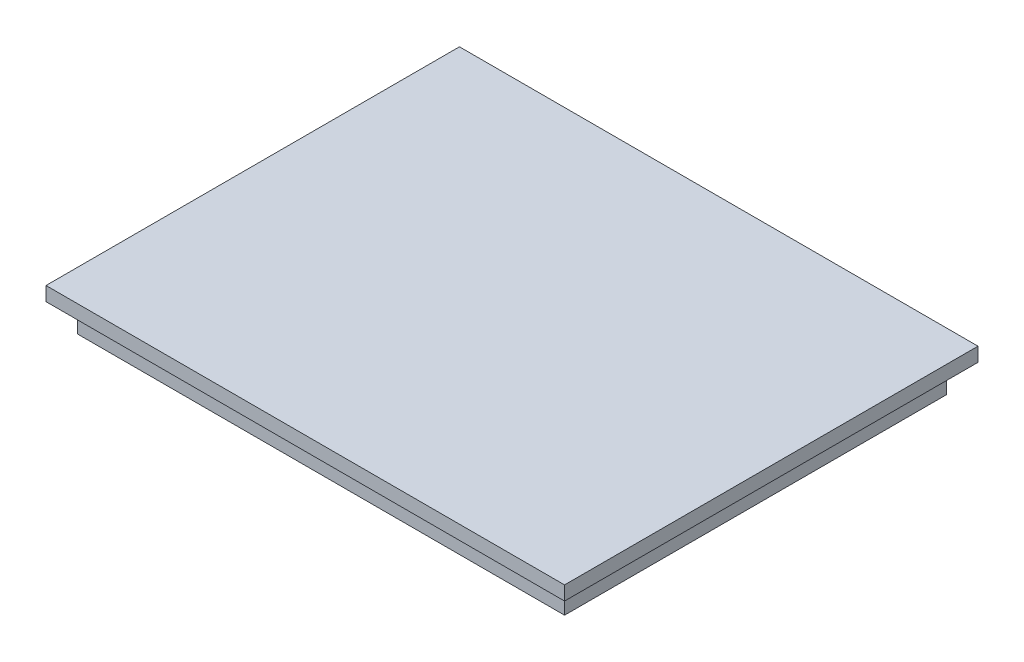
ISO-10303-21;
HEADER;
FILE_DESCRIPTION(('STEP AP214'),'2;1');
FILE_NAME('part.step','',(''),(''),'','','');
FILE_SCHEMA(('AUTOMOTIVE_DESIGN { 1 0 10303 214 1 1 1 1 }'));
ENDSEC;
DATA;
#1=APPLICATION_CONTEXT('core data for automotive mechanical design processes');
#2=APPLICATION_PROTOCOL_DEFINITION('international standard','automotive_design',2000,#1);
#3=PRODUCT_CONTEXT('',#1,'mechanical');
#4=PRODUCT('Part','Part','',(#3));
#5=PRODUCT_RELATED_PRODUCT_CATEGORY('part','',(#4));
#6=PRODUCT_DEFINITION_FORMATION('','',#4);
#7=PRODUCT_DEFINITION_CONTEXT('part definition',#1,'design');
#8=PRODUCT_DEFINITION('design','',#6,#7);
#9=PRODUCT_DEFINITION_SHAPE('','',#8);
#10=(LENGTH_UNIT() NAMED_UNIT(*) SI_UNIT(.MILLI.,.METRE.));
#11=(NAMED_UNIT(*) PLANE_ANGLE_UNIT() SI_UNIT($,.RADIAN.));
#12=(NAMED_UNIT(*) SI_UNIT($,.STERADIAN.) SOLID_ANGLE_UNIT());
#13=UNCERTAINTY_MEASURE_WITH_UNIT(LENGTH_MEASURE(1.E-05),#10,'distance_accuracy_value','');
#14=(GEOMETRIC_REPRESENTATION_CONTEXT(3) GLOBAL_UNCERTAINTY_ASSIGNED_CONTEXT((#13)) GLOBAL_UNIT_ASSIGNED_CONTEXT((#10,
#11,#12)) REPRESENTATION_CONTEXT('',''));
#15=CARTESIAN_POINT('',(0.,0.,0.));
#16=DIRECTION('',(0.,0.,1.));
#17=DIRECTION('',(1.,0.,0.));
#18=AXIS2_PLACEMENT_3D('',#15,#16,#17);
#19=CARTESIAN_POINT('',(0.,0.,0.));
#20=DIRECTION('',(0.,-1.,0.));
#21=DIRECTION('',(0.,0.,-1.));
#22=AXIS2_PLACEMENT_3D('',#19,#20,#21);
#23=PLANE('',#22);
#24=DIRECTION('',(0.,0.,-1.));
#25=VECTOR('',#24,1.);
#26=CARTESIAN_POINT('',(37.,0.,29.5));
#27=LINE('',#26,#25);
#28=CARTESIAN_POINT('',(37.,0.,29.5));
#29=VERTEX_POINT('',#28);
#30=CARTESIAN_POINT('',(37.,0.,-29.5));
#31=VERTEX_POINT('',#30);
#32=EDGE_CURVE('E217',#29,#31,#27,.T.);
#33=ORIENTED_EDGE('',*,*,#32,.F.);
#34=DIRECTION('',(1.,0.,0.));
#35=VECTOR('',#34,1.);
#36=CARTESIAN_POINT('',(-37.,0.,29.5));
#37=LINE('',#36,#35);
#38=CARTESIAN_POINT('',(-37.,0.,29.5));
#39=VERTEX_POINT('',#38);
#40=EDGE_CURVE('E229',#39,#29,#37,.T.);
#41=ORIENTED_EDGE('',*,*,#40,.F.);
#42=DIRECTION('',(0.,0.,1.));
#43=VECTOR('',#42,1.);
#44=CARTESIAN_POINT('',(-37.,0.,29.5));
#45=LINE('',#44,#43);
#46=CARTESIAN_POINT('',(-37.,0.,-29.5));
#47=VERTEX_POINT('',#46);
#48=EDGE_CURVE('E245',#47,#39,#45,.T.);
#49=ORIENTED_EDGE('',*,*,#48,.F.);
#50=DIRECTION('',(-1.,0.,0.));
#51=VECTOR('',#50,1.);
#52=CARTESIAN_POINT('',(-37.,0.,-29.5));
#53=LINE('',#52,#51);
#54=EDGE_CURVE('E242',#31,#47,#53,.T.);
#55=ORIENTED_EDGE('',*,*,#54,.F.);
#56=EDGE_LOOP('',(#33,#41,#49,#55));
#57=FACE_BOUND('',#56,.T.);
#58=DIRECTION('',(0.,0.,1.));
#59=VECTOR('',#58,1.);
#60=CARTESIAN_POINT('',(34.75,0.,0.));
#61=LINE('',#60,#59);
#62=CARTESIAN_POINT('',(34.75,0.,-27.25));
#63=VERTEX_POINT('',#62);
#64=CARTESIAN_POINT('',(34.75,0.,27.25));
#65=VERTEX_POINT('',#64);
#66=EDGE_CURVE('E63',#63,#65,#61,.T.);
#67=ORIENTED_EDGE('',*,*,#66,.F.);
#68=DIRECTION('',(1.,0.,0.));
#69=VECTOR('',#68,1.);
#70=CARTESIAN_POINT('',(0.,0.,-27.25));
#71=LINE('',#70,#69);
#72=CARTESIAN_POINT('',(-34.75,0.,-27.25));
#73=VERTEX_POINT('',#72);
#74=EDGE_CURVE('E192',#73,#63,#71,.T.);
#75=ORIENTED_EDGE('',*,*,#74,.F.);
#76=DIRECTION('',(0.,0.,1.));
#77=VECTOR('',#76,1.);
#78=CARTESIAN_POINT('',(-34.75,0.,0.));
#79=LINE('',#78,#77);
#80=CARTESIAN_POINT('',(-34.75,0.,27.25));
#81=VERTEX_POINT('',#80);
#82=EDGE_CURVE('E153',#73,#81,#79,.T.);
#83=ORIENTED_EDGE('',*,*,#82,.T.);
#84=DIRECTION('',(1.,0.,0.));
#85=VECTOR('',#84,1.);
#86=CARTESIAN_POINT('',(0.,0.,27.25));
#87=LINE('',#86,#85);
#88=EDGE_CURVE('E198',#81,#65,#87,.T.);
#89=ORIENTED_EDGE('',*,*,#88,.T.);
#90=EDGE_LOOP('',(#67,#75,#83,#89));
#91=FACE_BOUND('',#90,.T.);
#92=ADVANCED_FACE('F39',(#57,#91),#23,.T.);
#93=CARTESIAN_POINT('',(37.,2.,29.5));
#94=DIRECTION('',(-1.,0.,0.));
#95=DIRECTION('',(0.,0.,1.));
#96=AXIS2_PLACEMENT_3D('',#93,#94,#95);
#97=PLANE('',#96);
#98=ORIENTED_EDGE('',*,*,#32,.T.);
#99=DIRECTION('',(0.,-1.,0.));
#100=VECTOR('',#99,1.);
#101=CARTESIAN_POINT('',(37.,2.,-29.5));
#102=LINE('',#101,#100);
#103=CARTESIAN_POINT('',(37.,2.,-29.5));
#104=VERTEX_POINT('',#103);
#105=EDGE_CURVE('E11',#104,#31,#102,.T.);
#106=ORIENTED_EDGE('',*,*,#105,.F.);
#107=DIRECTION('',(0.,0.,-1.));
#108=VECTOR('',#107,1.);
#109=CARTESIAN_POINT('',(37.,2.,29.5));
#110=LINE('',#109,#108);
#111=CARTESIAN_POINT('',(37.,2.,29.5));
#112=VERTEX_POINT('',#111);
#113=EDGE_CURVE('E224',#112,#104,#110,.T.);
#114=ORIENTED_EDGE('',*,*,#113,.F.);
#115=DIRECTION('',(0.,-1.,0.));
#116=VECTOR('',#115,1.);
#117=CARTESIAN_POINT('',(37.,2.,29.5));
#118=LINE('',#117,#116);
#119=EDGE_CURVE('E238',#112,#29,#118,.T.);
#120=ORIENTED_EDGE('',*,*,#119,.T.);
#121=EDGE_LOOP('',(#98,#106,#114,#120));
#122=FACE_BOUND('',#121,.T.);
#123=ADVANCED_FACE('F41',(#122),#97,.F.);
#124=CARTESIAN_POINT('',(-37.,2.,-29.5));
#125=DIRECTION('',(0.,0.,1.));
#126=DIRECTION('',(1.,0.,0.));
#127=AXIS2_PLACEMENT_3D('',#124,#125,#126);
#128=PLANE('',#127);
#129=ORIENTED_EDGE('',*,*,#54,.T.);
#130=DIRECTION('',(0.,-1.,0.));
#131=VECTOR('',#130,1.);
#132=CARTESIAN_POINT('',(-37.,2.,-29.5));
#133=LINE('',#132,#131);
#134=CARTESIAN_POINT('',(-37.,2.,-29.5));
#135=VERTEX_POINT('',#134);
#136=EDGE_CURVE('E48',#135,#47,#133,.T.);
#137=ORIENTED_EDGE('',*,*,#136,.F.);
#138=DIRECTION('',(-1.,0.,0.));
#139=VECTOR('',#138,1.);
#140=CARTESIAN_POINT('',(-37.,2.,-29.5));
#141=LINE('',#140,#139);
#142=EDGE_CURVE('E228',#104,#135,#141,.T.);
#143=ORIENTED_EDGE('',*,*,#142,.F.);
#144=ORIENTED_EDGE('',*,*,#105,.T.);
#145=EDGE_LOOP('',(#129,#137,#143,#144));
#146=FACE_BOUND('',#145,.T.);
#147=ADVANCED_FACE('F277',(#146),#128,.F.);
#148=CARTESIAN_POINT('',(-37.,2.,29.5));
#149=DIRECTION('',(1.,0.,0.));
#150=DIRECTION('',(0.,0.,-1.));
#151=AXIS2_PLACEMENT_3D('',#148,#149,#150);
#152=PLANE('',#151);
#153=ORIENTED_EDGE('',*,*,#48,.T.);
#154=DIRECTION('',(0.,-1.,0.));
#155=VECTOR('',#154,1.);
#156=CARTESIAN_POINT('',(-37.,2.,29.5));
#157=LINE('',#156,#155);
#158=CARTESIAN_POINT('',(-37.,2.,29.5));
#159=VERTEX_POINT('',#158);
#160=EDGE_CURVE('E253',#159,#39,#157,.T.);
#161=ORIENTED_EDGE('',*,*,#160,.F.);
#162=DIRECTION('',(0.,0.,1.));
#163=VECTOR('',#162,1.);
#164=CARTESIAN_POINT('',(-37.,2.,29.5));
#165=LINE('',#164,#163);
#166=EDGE_CURVE('E232',#135,#159,#165,.T.);
#167=ORIENTED_EDGE('',*,*,#166,.F.);
#168=ORIENTED_EDGE('',*,*,#136,.T.);
#169=EDGE_LOOP('',(#153,#161,#167,#168));
#170=FACE_BOUND('',#169,.T.);
#171=ADVANCED_FACE('F262',(#170),#152,.F.);
#172=CARTESIAN_POINT('',(-37.,2.,29.5));
#173=DIRECTION('',(0.,0.,-1.));
#174=DIRECTION('',(-1.,0.,0.));
#175=AXIS2_PLACEMENT_3D('',#172,#173,#174);
#176=PLANE('',#175);
#177=ORIENTED_EDGE('',*,*,#40,.T.);
#178=ORIENTED_EDGE('',*,*,#119,.F.);
#179=DIRECTION('',(1.,0.,0.));
#180=VECTOR('',#179,1.);
#181=CARTESIAN_POINT('',(-37.,2.,29.5));
#182=LINE('',#181,#180);
#183=EDGE_CURVE('E235',#159,#112,#182,.T.);
#184=ORIENTED_EDGE('',*,*,#183,.F.);
#185=ORIENTED_EDGE('',*,*,#160,.T.);
#186=EDGE_LOOP('',(#177,#178,#184,#185));
#187=FACE_BOUND('',#186,.T.);
#188=ADVANCED_FACE('F270',(#187),#176,.F.);
#189=CARTESIAN_POINT('',(0.,2.,0.));
#190=DIRECTION('',(0.,-1.,0.));
#191=DIRECTION('',(0.,0.,-1.));
#192=AXIS2_PLACEMENT_3D('',#189,#190,#191);
#193=PLANE('',#192);
#194=ORIENTED_EDGE('',*,*,#113,.T.);
#195=ORIENTED_EDGE('',*,*,#142,.T.);
#196=ORIENTED_EDGE('',*,*,#166,.T.);
#197=ORIENTED_EDGE('',*,*,#183,.T.);
#198=EDGE_LOOP('',(#194,#195,#196,#197));
#199=FACE_BOUND('',#198,.T.);
#200=ADVANCED_FACE('F276',(#199),#193,.F.);
#201=CARTESIAN_POINT('',(0.,-4.,-27.25));
#202=DIRECTION('',(0.,0.,1.));
#203=DIRECTION('',(1.,0.,0.));
#204=AXIS2_PLACEMENT_3D('',#201,#202,#203);
#205=PLANE('',#204);
#206=ORIENTED_EDGE('',*,*,#74,.T.);
#207=DIRECTION('',(0.,1.,0.));
#208=VECTOR('',#207,1.);
#209=CARTESIAN_POINT('',(34.75,-4.,-27.25));
#210=LINE('',#209,#208);
#211=CARTESIAN_POINT('',(34.75,-4.,-27.25));
#212=VERTEX_POINT('',#211);
#213=EDGE_CURVE('E214',#212,#63,#210,.T.);
#214=ORIENTED_EDGE('',*,*,#213,.F.);
#215=DIRECTION('',(1.,0.,0.));
#216=VECTOR('',#215,1.);
#217=CARTESIAN_POINT('',(0.,-4.,-27.25));
#218=LINE('',#217,#216);
#219=CARTESIAN_POINT('',(-34.75,-4.,-27.25));
#220=VERTEX_POINT('',#219);
#221=EDGE_CURVE('E165',#220,#212,#218,.T.);
#222=ORIENTED_EDGE('',*,*,#221,.F.);
#223=DIRECTION('',(0.,1.,0.));
#224=VECTOR('',#223,1.);
#225=CARTESIAN_POINT('',(-34.75,-4.,-27.25));
#226=LINE('',#225,#224);
#227=EDGE_CURVE('E142',#220,#73,#226,.T.);
#228=ORIENTED_EDGE('',*,*,#227,.T.);
#229=EDGE_LOOP('',(#206,#214,#222,#228));
#230=FACE_BOUND('',#229,.T.);
#231=ADVANCED_FACE('F313',(#230),#205,.F.);
#232=CARTESIAN_POINT('',(34.75,-4.,0.));
#233=DIRECTION('',(-1.,0.,0.));
#234=DIRECTION('',(0.,0.,1.));
#235=AXIS2_PLACEMENT_3D('',#232,#233,#234);
#236=PLANE('',#235);
#237=ORIENTED_EDGE('',*,*,#66,.T.);
#238=DIRECTION('',(0.,1.,0.));
#239=VECTOR('',#238,1.);
#240=CARTESIAN_POINT('',(34.75,-4.,27.25));
#241=LINE('',#240,#239);
#242=CARTESIAN_POINT('',(34.75,-4.,27.25));
#243=VERTEX_POINT('',#242);
#244=EDGE_CURVE('E210',#243,#65,#241,.T.);
#245=ORIENTED_EDGE('',*,*,#244,.F.);
#246=DIRECTION('',(0.,0.,1.));
#247=VECTOR('',#246,1.);
#248=CARTESIAN_POINT('',(34.75,-4.,0.));
#249=LINE('',#248,#247);
#250=EDGE_CURVE('E169',#212,#243,#249,.T.);
#251=ORIENTED_EDGE('',*,*,#250,.F.);
#252=ORIENTED_EDGE('',*,*,#213,.T.);
#253=EDGE_LOOP('',(#237,#245,#251,#252));
#254=FACE_BOUND('',#253,.T.);
#255=ADVANCED_FACE('F325',(#254),#236,.F.);
#256=CARTESIAN_POINT('',(0.,-4.,27.25));
#257=DIRECTION('',(0.,0.,1.));
#258=DIRECTION('',(1.,0.,0.));
#259=AXIS2_PLACEMENT_3D('',#256,#257,#258);
#260=PLANE('',#259);
#261=ORIENTED_EDGE('',*,*,#88,.F.);
#262=DIRECTION('',(0.,1.,0.));
#263=VECTOR('',#262,1.);
#264=CARTESIAN_POINT('',(-34.75,-4.,27.25));
#265=LINE('',#264,#263);
#266=CARTESIAN_POINT('',(-34.75,-4.,27.25));
#267=VERTEX_POINT('',#266);
#268=EDGE_CURVE('E206',#267,#81,#265,.T.);
#269=ORIENTED_EDGE('',*,*,#268,.F.);
#270=DIRECTION('',(1.,0.,0.));
#271=VECTOR('',#270,1.);
#272=CARTESIAN_POINT('',(0.,-4.,27.25));
#273=LINE('',#272,#271);
#274=EDGE_CURVE('E172',#267,#243,#273,.T.);
#275=ORIENTED_EDGE('',*,*,#274,.T.);
#276=ORIENTED_EDGE('',*,*,#244,.T.);
#277=EDGE_LOOP('',(#261,#269,#275,#276));
#278=FACE_BOUND('',#277,.T.);
#279=ADVANCED_FACE('F319',(#278),#260,.T.);
#280=CARTESIAN_POINT('',(32.75,-4.,0.));
#281=DIRECTION('',(-1.,0.,0.));
#282=DIRECTION('',(0.,0.,1.));
#283=AXIS2_PLACEMENT_3D('',#280,#281,#282);
#284=PLANE('',#283);
#285=DIRECTION('',(0.,0.,1.));
#286=VECTOR('',#285,1.);
#287=CARTESIAN_POINT('',(32.75,0.,0.));
#288=LINE('',#287,#286);
#289=CARTESIAN_POINT('',(32.75,0.,-25.25));
#290=VERTEX_POINT('',#289);
#291=CARTESIAN_POINT('',(32.75,0.,25.25));
#292=VERTEX_POINT('',#291);
#293=EDGE_CURVE('E136',#290,#292,#288,.T.);
#294=ORIENTED_EDGE('',*,*,#293,.F.);
#295=DIRECTION('',(0.,1.,0.));
#296=VECTOR('',#295,1.);
#297=CARTESIAN_POINT('',(32.75,-4.,-25.25));
#298=LINE('',#297,#296);
#299=CARTESIAN_POINT('',(32.75,-4.,-25.25));
#300=VERTEX_POINT('',#299);
#301=EDGE_CURVE('E131',#300,#290,#298,.T.);
#302=ORIENTED_EDGE('',*,*,#301,.F.);
#303=DIRECTION('',(0.,0.,1.));
#304=VECTOR('',#303,1.);
#305=CARTESIAN_POINT('',(32.75,-4.,0.));
#306=LINE('',#305,#304);
#307=CARTESIAN_POINT('',(32.75,-4.,25.25));
#308=VERTEX_POINT('',#307);
#309=EDGE_CURVE('E134',#300,#308,#306,.T.);
#310=ORIENTED_EDGE('',*,*,#309,.T.);
#311=DIRECTION('',(0.,1.,0.));
#312=VECTOR('',#311,1.);
#313=CARTESIAN_POINT('',(32.75,-4.,25.25));
#314=LINE('',#313,#312);
#315=EDGE_CURVE('E180',#308,#292,#314,.T.);
#316=ORIENTED_EDGE('',*,*,#315,.T.);
#317=EDGE_LOOP('',(#294,#302,#310,#316));
#318=FACE_BOUND('',#317,.T.);
#319=ADVANCED_FACE('F133',(#318),#284,.T.);
#320=CARTESIAN_POINT('',(0.,-4.,-25.25));
#321=DIRECTION('',(0.,0.,1.));
#322=DIRECTION('',(1.,0.,0.));
#323=AXIS2_PLACEMENT_3D('',#320,#321,#322);
#324=PLANE('',#323);
#325=DIRECTION('',(1.,0.,0.));
#326=VECTOR('',#325,1.);
#327=CARTESIAN_POINT('',(0.,0.,-25.25));
#328=LINE('',#327,#326);
#329=CARTESIAN_POINT('',(-32.75,0.,-25.25));
#330=VERTEX_POINT('',#329);
#331=EDGE_CURVE('E183',#330,#290,#328,.T.);
#332=ORIENTED_EDGE('',*,*,#331,.F.);
#333=DIRECTION('',(0.,1.,0.));
#334=VECTOR('',#333,1.);
#335=CARTESIAN_POINT('',(-32.75,-4.,-25.25));
#336=LINE('',#335,#334);
#337=CARTESIAN_POINT('',(-32.75,-4.,-25.25));
#338=VERTEX_POINT('',#337);
#339=EDGE_CURVE('E143',#338,#330,#336,.T.);
#340=ORIENTED_EDGE('',*,*,#339,.F.);
#341=DIRECTION('',(1.,0.,0.));
#342=VECTOR('',#341,1.);
#343=CARTESIAN_POINT('',(0.,-4.,-25.25));
#344=LINE('',#343,#342);
#345=EDGE_CURVE('E149',#338,#300,#344,.T.);
#346=ORIENTED_EDGE('',*,*,#345,.T.);
#347=ORIENTED_EDGE('',*,*,#301,.T.);
#348=EDGE_LOOP('',(#332,#340,#346,#347));
#349=FACE_BOUND('',#348,.T.);
#350=ADVANCED_FACE('F155',(#349),#324,.T.);
#351=CARTESIAN_POINT('',(-32.75,-4.,0.));
#352=DIRECTION('',(-1.,0.,0.));
#353=DIRECTION('',(0.,0.,1.));
#354=AXIS2_PLACEMENT_3D('',#351,#352,#353);
#355=PLANE('',#354);
#356=DIRECTION('',(0.,0.,1.));
#357=VECTOR('',#356,1.);
#358=CARTESIAN_POINT('',(-32.75,0.,0.));
#359=LINE('',#358,#357);
#360=CARTESIAN_POINT('',(-32.75,0.,25.25));
#361=VERTEX_POINT('',#360);
#362=EDGE_CURVE('E186',#330,#361,#359,.T.);
#363=ORIENTED_EDGE('',*,*,#362,.T.);
#364=DIRECTION('',(0.,1.,0.));
#365=VECTOR('',#364,1.);
#366=CARTESIAN_POINT('',(-32.75,-4.,25.25));
#367=LINE('',#366,#365);
#368=CARTESIAN_POINT('',(-32.75,-4.,25.25));
#369=VERTEX_POINT('',#368);
#370=EDGE_CURVE('E55',#369,#361,#367,.T.);
#371=ORIENTED_EDGE('',*,*,#370,.F.);
#372=DIRECTION('',(0.,0.,1.));
#373=VECTOR('',#372,1.);
#374=CARTESIAN_POINT('',(-32.75,-4.,0.));
#375=LINE('',#374,#373);
#376=EDGE_CURVE('E158',#338,#369,#375,.T.);
#377=ORIENTED_EDGE('',*,*,#376,.F.);
#378=ORIENTED_EDGE('',*,*,#339,.T.);
#379=EDGE_LOOP('',(#363,#371,#377,#378));
#380=FACE_BOUND('',#379,.T.);
#381=ADVANCED_FACE('F301',(#380),#355,.F.);
#382=CARTESIAN_POINT('',(0.,-4.,25.25));
#383=DIRECTION('',(0.,0.,1.));
#384=DIRECTION('',(1.,0.,0.));
#385=AXIS2_PLACEMENT_3D('',#382,#383,#384);
#386=PLANE('',#385);
#387=DIRECTION('',(1.,0.,0.));
#388=VECTOR('',#387,1.);
#389=CARTESIAN_POINT('',(0.,0.,25.25));
#390=LINE('',#389,#388);
#391=EDGE_CURVE('E189',#361,#292,#390,.T.);
#392=ORIENTED_EDGE('',*,*,#391,.T.);
#393=ORIENTED_EDGE('',*,*,#315,.F.);
#394=DIRECTION('',(1.,0.,0.));
#395=VECTOR('',#394,1.);
#396=CARTESIAN_POINT('',(0.,-4.,25.25));
#397=LINE('',#396,#395);
#398=EDGE_CURVE('E150',#369,#308,#397,.T.);
#399=ORIENTED_EDGE('',*,*,#398,.F.);
#400=ORIENTED_EDGE('',*,*,#370,.T.);
#401=EDGE_LOOP('',(#392,#393,#399,#400));
#402=FACE_BOUND('',#401,.T.);
#403=ADVANCED_FACE('F302',(#402),#386,.F.);
#404=CARTESIAN_POINT('',(-34.75,-4.,0.));
#405=DIRECTION('',(-1.,0.,0.));
#406=DIRECTION('',(0.,0.,1.));
#407=AXIS2_PLACEMENT_3D('',#404,#405,#406);
#408=PLANE('',#407);
#409=ORIENTED_EDGE('',*,*,#82,.F.);
#410=ORIENTED_EDGE('',*,*,#227,.F.);
#411=DIRECTION('',(0.,0.,1.));
#412=VECTOR('',#411,1.);
#413=CARTESIAN_POINT('',(-34.75,-4.,0.));
#414=LINE('',#413,#412);
#415=EDGE_CURVE('E176',#220,#267,#414,.T.);
#416=ORIENTED_EDGE('',*,*,#415,.T.);
#417=ORIENTED_EDGE('',*,*,#268,.T.);
#418=EDGE_LOOP('',(#409,#410,#416,#417));
#419=FACE_BOUND('',#418,.T.);
#420=ADVANCED_FACE('F296',(#419),#408,.T.);
#421=CARTESIAN_POINT('',(0.,-4.,0.));
#422=DIRECTION('',(0.,-1.,0.));
#423=DIRECTION('',(0.,0.,-1.));
#424=AXIS2_PLACEMENT_3D('',#421,#422,#423);
#425=PLANE('',#424);
#426=ORIENTED_EDGE('',*,*,#309,.F.);
#427=ORIENTED_EDGE('',*,*,#345,.F.);
#428=ORIENTED_EDGE('',*,*,#376,.T.);
#429=ORIENTED_EDGE('',*,*,#398,.T.);
#430=EDGE_LOOP('',(#426,#427,#428,#429));
#431=FACE_BOUND('',#430,.T.);
#432=ORIENTED_EDGE('',*,*,#221,.T.);
#433=ORIENTED_EDGE('',*,*,#250,.T.);
#434=ORIENTED_EDGE('',*,*,#274,.F.);
#435=ORIENTED_EDGE('',*,*,#415,.F.);
#436=EDGE_LOOP('',(#432,#433,#434,#435));
#437=FACE_BOUND('',#436,.T.);
#438=ADVANCED_FACE('F147',(#431,#437),#425,.T.);
#439=ORIENTED_EDGE('',*,*,#293,.T.);
#440=ORIENTED_EDGE('',*,*,#391,.F.);
#441=ORIENTED_EDGE('',*,*,#362,.F.);
#442=ORIENTED_EDGE('',*,*,#331,.T.);
#443=EDGE_LOOP('',(#439,#440,#441,#442));
#444=FACE_BOUND('',#443,.T.);
#445=ADVANCED_FACE('F286',(#444),#23,.T.);
#446=CLOSED_SHELL('',(#92,#123,#147,#171,#188,#200,#231,#255,#279,#319,#350,#381,#403,#420,#438,#445));
#447=MANIFOLD_SOLID_BREP('B2',#446);
#448=ADVANCED_BREP_SHAPE_REPRESENTATION('',(#18,#447),#14);
#449=SHAPE_DEFINITION_REPRESENTATION(#9,#448);
ENDSEC;
END-ISO-10303-21;
